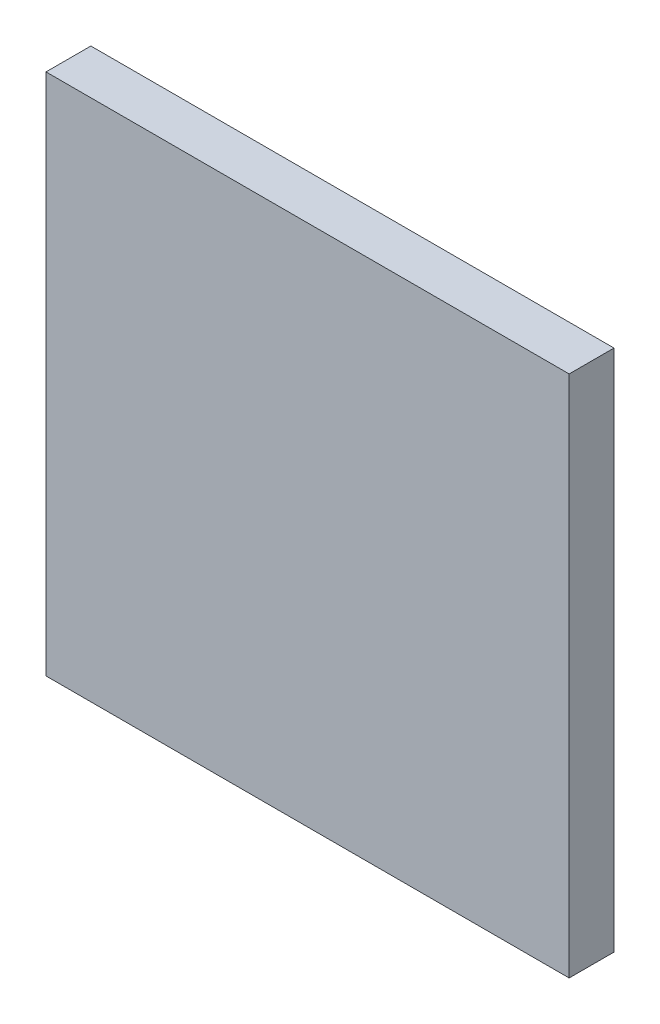
ISO-10303-21;
HEADER;
FILE_DESCRIPTION(('STEP AP214'),'2;1');
FILE_NAME('part.step','',(''),(''),'','','');
FILE_SCHEMA(('AUTOMOTIVE_DESIGN { 1 0 10303 214 1 1 1 1 }'));
ENDSEC;
DATA;
#1=APPLICATION_CONTEXT('core data for automotive mechanical design processes');
#2=APPLICATION_PROTOCOL_DEFINITION('international standard','automotive_design',2000,#1);
#3=PRODUCT_CONTEXT('',#1,'mechanical');
#4=PRODUCT('Part','Part','',(#3));
#5=PRODUCT_RELATED_PRODUCT_CATEGORY('part','',(#4));
#6=PRODUCT_DEFINITION_FORMATION('','',#4);
#7=PRODUCT_DEFINITION_CONTEXT('part definition',#1,'design');
#8=PRODUCT_DEFINITION('design','',#6,#7);
#9=PRODUCT_DEFINITION_SHAPE('','',#8);
#10=(LENGTH_UNIT() NAMED_UNIT(*) SI_UNIT(.MILLI.,.METRE.));
#11=(NAMED_UNIT(*) PLANE_ANGLE_UNIT() SI_UNIT($,.RADIAN.));
#12=(NAMED_UNIT(*) SI_UNIT($,.STERADIAN.) SOLID_ANGLE_UNIT());
#13=UNCERTAINTY_MEASURE_WITH_UNIT(LENGTH_MEASURE(1.E-05),#10,'distance_accuracy_value','');
#14=(GEOMETRIC_REPRESENTATION_CONTEXT(3) GLOBAL_UNCERTAINTY_ASSIGNED_CONTEXT((#13)) GLOBAL_UNIT_ASSIGNED_CONTEXT((#10,
#11,#12)) REPRESENTATION_CONTEXT('',''));
#15=CARTESIAN_POINT('',(0.,0.,0.));
#16=DIRECTION('',(0.,0.,1.));
#17=DIRECTION('',(1.,0.,0.));
#18=AXIS2_PLACEMENT_3D('',#15,#16,#17);
#19=CARTESIAN_POINT('',(-7.00000124,-7.00000124,1.20000014));
#20=DIRECTION('',(0.,0.,-1.));
#21=DIRECTION('',(-1.,0.,0.));
#22=AXIS2_PLACEMENT_3D('',#19,#20,#21);
#23=PLANE('',#22);
#24=DIRECTION('',(0.,1.,0.));
#25=VECTOR('',#24,1.);
#26=CARTESIAN_POINT('',(7.00000124,-7.00000124,1.20000014));
#27=LINE('',#26,#25);
#28=CARTESIAN_POINT('',(7.00000124,-7.00000124,1.20000014));
#29=VERTEX_POINT('',#28);
#30=CARTESIAN_POINT('',(7.00000124,7.00000124,1.20000014));
#31=VERTEX_POINT('',#30);
#32=EDGE_CURVE('E54',#29,#31,#27,.T.);
#33=ORIENTED_EDGE('',*,*,#32,.T.);
#34=DIRECTION('',(1.,0.,0.));
#35=VECTOR('',#34,1.);
#36=CARTESIAN_POINT('',(7.00000124,7.00000124,1.20000014));
#37=LINE('',#36,#35);
#38=CARTESIAN_POINT('',(-7.00000124,7.00000124,1.20000014));
#39=VERTEX_POINT('',#38);
#40=EDGE_CURVE('E56',#31,#39,#37,.F.);
#41=ORIENTED_EDGE('',*,*,#40,.T.);
#42=DIRECTION('',(0.,1.,0.));
#43=VECTOR('',#42,1.);
#44=CARTESIAN_POINT('',(-7.00000124,7.00000124,1.20000014));
#45=LINE('',#44,#43);
#46=CARTESIAN_POINT('',(-7.00000124,-7.00000124,1.20000014));
#47=VERTEX_POINT('',#46);
#48=EDGE_CURVE('E19',#39,#47,#45,.F.);
#49=ORIENTED_EDGE('',*,*,#48,.T.);
#50=DIRECTION('',(1.,0.,0.));
#51=VECTOR('',#50,1.);
#52=CARTESIAN_POINT('',(-7.00000124,-7.00000124,1.20000014));
#53=LINE('',#52,#51);
#54=EDGE_CURVE('E79',#47,#29,#53,.T.);
#55=ORIENTED_EDGE('',*,*,#54,.T.);
#56=EDGE_LOOP('',(#33,#41,#49,#55));
#57=FACE_BOUND('',#56,.T.);
#58=ADVANCED_FACE('F16',(#57),#23,.F.);
#59=CARTESIAN_POINT('',(-7.00000124,7.00000124,0.));
#60=DIRECTION('',(1.,0.,0.));
#61=DIRECTION('',(0.,0.,-1.));
#62=AXIS2_PLACEMENT_3D('',#59,#60,#61);
#63=PLANE('',#62);
#64=DIRECTION('',(0.,0.,1.));
#65=VECTOR('',#64,1.);
#66=CARTESIAN_POINT('',(-7.00000124,-7.00000124,0.));
#67=LINE('',#66,#65);
#68=CARTESIAN_POINT('',(-7.00000124,-7.00000124,0.));
#69=VERTEX_POINT('',#68);
#70=EDGE_CURVE('E67',#69,#47,#67,.T.);
#71=ORIENTED_EDGE('',*,*,#70,.T.);
#72=ORIENTED_EDGE('',*,*,#48,.F.);
#73=DIRECTION('',(0.,0.,-1.));
#74=VECTOR('',#73,1.);
#75=CARTESIAN_POINT('',(-7.00000124,7.00000124,0.));
#76=LINE('',#75,#74);
#77=CARTESIAN_POINT('',(-7.00000124,7.00000124,0.));
#78=VERTEX_POINT('',#77);
#79=EDGE_CURVE('E62',#39,#78,#76,.T.);
#80=ORIENTED_EDGE('',*,*,#79,.T.);
#81=DIRECTION('',(0.,1.,0.));
#82=VECTOR('',#81,1.);
#83=CARTESIAN_POINT('',(-7.00000124,-7.00000124,0.));
#84=LINE('',#83,#82);
#85=EDGE_CURVE('E82',#69,#78,#84,.T.);
#86=ORIENTED_EDGE('',*,*,#85,.F.);
#87=EDGE_LOOP('',(#71,#72,#80,#86));
#88=FACE_BOUND('',#87,.T.);
#89=ADVANCED_FACE('F64',(#88),#63,.F.);
#90=CARTESIAN_POINT('',(7.00000124,7.00000124,0.));
#91=DIRECTION('',(0.,-1.,0.));
#92=DIRECTION('',(0.,0.,-1.));
#93=AXIS2_PLACEMENT_3D('',#90,#91,#92);
#94=PLANE('',#93);
#95=ORIENTED_EDGE('',*,*,#79,.F.);
#96=ORIENTED_EDGE('',*,*,#40,.F.);
#97=DIRECTION('',(0.,0.,1.));
#98=VECTOR('',#97,1.);
#99=CARTESIAN_POINT('',(7.00000124,7.00000124,0.));
#100=LINE('',#99,#98);
#101=CARTESIAN_POINT('',(7.00000124,7.00000124,0.));
#102=VERTEX_POINT('',#101);
#103=EDGE_CURVE('E74',#31,#102,#100,.F.);
#104=ORIENTED_EDGE('',*,*,#103,.T.);
#105=DIRECTION('',(-1.,0.,0.));
#106=VECTOR('',#105,1.);
#107=CARTESIAN_POINT('',(-7.00000124,7.00000124,0.));
#108=LINE('',#107,#106);
#109=EDGE_CURVE('E71',#78,#102,#108,.F.);
#110=ORIENTED_EDGE('',*,*,#109,.F.);
#111=EDGE_LOOP('',(#95,#96,#104,#110));
#112=FACE_BOUND('',#111,.T.);
#113=ADVANCED_FACE('F69',(#112),#94,.F.);
#114=CARTESIAN_POINT('',(7.00000124,-7.00000124,0.));
#115=DIRECTION('',(-1.,0.,0.));
#116=DIRECTION('',(0.,0.,1.));
#117=AXIS2_PLACEMENT_3D('',#114,#115,#116);
#118=PLANE('',#117);
#119=ORIENTED_EDGE('',*,*,#103,.F.);
#120=ORIENTED_EDGE('',*,*,#32,.F.);
#121=DIRECTION('',(0.,0.,1.));
#122=VECTOR('',#121,1.);
#123=CARTESIAN_POINT('',(7.00000124,-7.00000124,0.));
#124=LINE('',#123,#122);
#125=CARTESIAN_POINT('',(7.00000124,-7.00000124,0.));
#126=VERTEX_POINT('',#125);
#127=EDGE_CURVE('E34',#29,#126,#124,.F.);
#128=ORIENTED_EDGE('',*,*,#127,.T.);
#129=DIRECTION('',(0.,1.,0.));
#130=VECTOR('',#129,1.);
#131=CARTESIAN_POINT('',(7.00000124,-7.00000124,0.));
#132=LINE('',#131,#130);
#133=EDGE_CURVE('E25',#102,#126,#132,.F.);
#134=ORIENTED_EDGE('',*,*,#133,.F.);
#135=EDGE_LOOP('',(#119,#120,#128,#134));
#136=FACE_BOUND('',#135,.T.);
#137=ADVANCED_FACE('F88',(#136),#118,.F.);
#138=CARTESIAN_POINT('',(-7.00000124,-7.00000124,0.));
#139=DIRECTION('',(0.,1.,0.));
#140=DIRECTION('',(0.,0.,1.));
#141=AXIS2_PLACEMENT_3D('',#138,#139,#140);
#142=PLANE('',#141);
#143=ORIENTED_EDGE('',*,*,#127,.F.);
#144=ORIENTED_EDGE('',*,*,#54,.F.);
#145=ORIENTED_EDGE('',*,*,#70,.F.);
#146=DIRECTION('',(-1.,0.,0.));
#147=VECTOR('',#146,1.);
#148=CARTESIAN_POINT('',(-7.00000124,-7.00000124,0.));
#149=LINE('',#148,#147);
#150=EDGE_CURVE('E11',#126,#69,#149,.T.);
#151=ORIENTED_EDGE('',*,*,#150,.F.);
#152=EDGE_LOOP('',(#143,#144,#145,#151));
#153=FACE_BOUND('',#152,.T.);
#154=ADVANCED_FACE('F90',(#153),#142,.F.);
#155=CARTESIAN_POINT('',(-7.00000124,-7.00000124,0.));
#156=DIRECTION('',(0.,0.,-1.));
#157=DIRECTION('',(-1.,0.,0.));
#158=AXIS2_PLACEMENT_3D('',#155,#156,#157);
#159=PLANE('',#158);
#160=ORIENTED_EDGE('',*,*,#133,.T.);
#161=ORIENTED_EDGE('',*,*,#150,.T.);
#162=ORIENTED_EDGE('',*,*,#85,.T.);
#163=ORIENTED_EDGE('',*,*,#109,.T.);
#164=EDGE_LOOP('',(#160,#161,#162,#163));
#165=FACE_BOUND('',#164,.T.);
#166=ADVANCED_FACE('F87',(#165),#159,.T.);
#167=CLOSED_SHELL('',(#58,#89,#113,#137,#154,#166));
#168=MANIFOLD_SOLID_BREP('B1',#167);
#169=ADVANCED_BREP_SHAPE_REPRESENTATION('',(#18,#168),#14);
#170=SHAPE_DEFINITION_REPRESENTATION(#9,#169);
ENDSEC;
END-ISO-10303-21;
